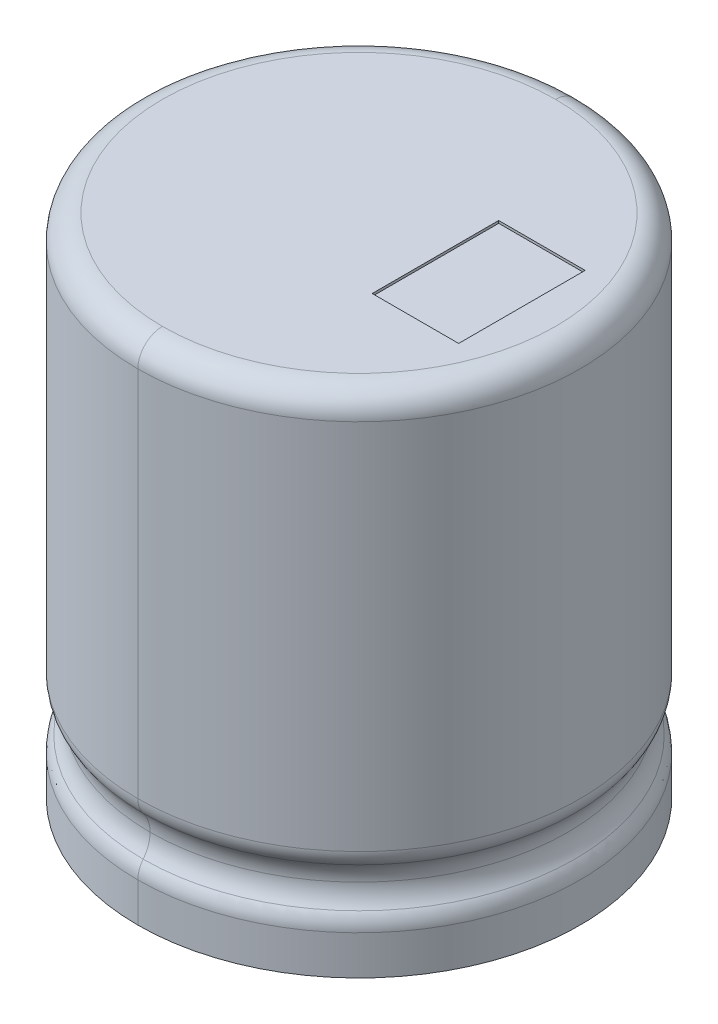
ISO-10303-21;
HEADER;
FILE_DESCRIPTION(('STEP AP214'),'2;1');
FILE_NAME('part.step','',(''),(''),'','','');
FILE_SCHEMA(('AUTOMOTIVE_DESIGN { 1 0 10303 214 1 1 1 1 }'));
ENDSEC;
DATA;
#1=APPLICATION_CONTEXT('core data for automotive mechanical design processes');
#2=APPLICATION_PROTOCOL_DEFINITION('international standard','automotive_design',2000,#1);
#3=PRODUCT_CONTEXT('',#1,'mechanical');
#4=PRODUCT('Part','Part','',(#3));
#5=PRODUCT_RELATED_PRODUCT_CATEGORY('part','',(#4));
#6=PRODUCT_DEFINITION_FORMATION('','',#4);
#7=PRODUCT_DEFINITION_CONTEXT('part definition',#1,'design');
#8=PRODUCT_DEFINITION('design','',#6,#7);
#9=PRODUCT_DEFINITION_SHAPE('','',#8);
#10=(LENGTH_UNIT() NAMED_UNIT(*) SI_UNIT(.MILLI.,.METRE.));
#11=(NAMED_UNIT(*) PLANE_ANGLE_UNIT() SI_UNIT($,.RADIAN.));
#12=(NAMED_UNIT(*) SI_UNIT($,.STERADIAN.) SOLID_ANGLE_UNIT());
#13=UNCERTAINTY_MEASURE_WITH_UNIT(LENGTH_MEASURE(1.E-05),#10,'distance_accuracy_value','');
#14=(GEOMETRIC_REPRESENTATION_CONTEXT(3) GLOBAL_UNCERTAINTY_ASSIGNED_CONTEXT((#13)) GLOBAL_UNIT_ASSIGNED_CONTEXT((#10,
#11,#12)) REPRESENTATION_CONTEXT('',''));
#15=CARTESIAN_POINT('',(0.,0.,0.));
#16=DIRECTION('',(0.,0.,1.));
#17=DIRECTION('',(1.,0.,0.));
#18=AXIS2_PLACEMENT_3D('',#15,#16,#17);
#19=CARTESIAN_POINT('',(0.,4.424695076596,0.));
#20=DIRECTION('',(0.,-1.,0.));
#21=DIRECTION('',(0.,0.,-1.));
#22=AXIS2_PLACEMENT_3D('',#19,#20,#21);
#23=TOROIDAL_SURFACE('',#22,9.8,1.3);
#24=CARTESIAN_POINT('',(0.,4.424695076596,-9.8));
#25=DIRECTION('',(-1.,0.,0.));
#26=DIRECTION('',(0.,0.,1.));
#27=AXIS2_PLACEMENT_3D('',#24,#25,#26);
#28=CIRCLE('',#27,1.3);
#29=CARTESIAN_POINT('',(0.,3.615426929541,-8.782608695652));
#30=VERTEX_POINT('',#29);
#31=CARTESIAN_POINT('',(0.,4.424695076596,-8.5));
#32=VERTEX_POINT('',#31);
#33=EDGE_CURVE('E11',#30,#32,#28,.T.);
#34=ORIENTED_EDGE('',*,*,#33,.T.);
#35=CARTESIAN_POINT('',(0.,4.424695076596,0.));
#36=DIRECTION('',(0.,-1.,0.));
#37=DIRECTION('',(0.,0.,-1.));
#38=AXIS2_PLACEMENT_3D('',#35,#36,#37);
#39=CIRCLE('',#38,8.5);
#40=CARTESIAN_POINT('',(0.,4.424695076596,8.5));
#41=VERTEX_POINT('',#40);
#42=EDGE_CURVE('E24',#32,#41,#39,.T.);
#43=ORIENTED_EDGE('',*,*,#42,.T.);
#44=CARTESIAN_POINT('',(0.,4.424695076596,9.8));
#45=DIRECTION('',(1.,0.,0.));
#46=DIRECTION('',(0.,0.,-1.));
#47=AXIS2_PLACEMENT_3D('',#44,#45,#46);
#48=CIRCLE('',#47,1.3);
#49=CARTESIAN_POINT('',(0.,3.615426929541,8.782608695652));
#50=VERTEX_POINT('',#49);
#51=EDGE_CURVE('E220',#50,#41,#48,.T.);
#52=ORIENTED_EDGE('',*,*,#51,.F.);
#53=CARTESIAN_POINT('',(0.,3.615426929541,0.));
#54=DIRECTION('',(0.,1.,0.));
#55=DIRECTION('',(0.,0.,1.));
#56=AXIS2_PLACEMENT_3D('',#53,#54,#55);
#57=CIRCLE('',#56,8.782608695652);
#58=EDGE_CURVE('E36',#50,#30,#57,.T.);
#59=ORIENTED_EDGE('',*,*,#58,.T.);
#60=EDGE_LOOP('',(#34,#43,#52,#59));
#61=FACE_BOUND('',#60,.T.);
#62=ADVANCED_FACE('F17',(#61),#23,.F.);
#63=CARTESIAN_POINT('',(0.,4.424695076596,0.));
#64=DIRECTION('',(0.,-1.,0.));
#65=DIRECTION('',(0.,0.,-1.));
#66=AXIS2_PLACEMENT_3D('',#63,#64,#65);
#67=TOROIDAL_SURFACE('',#66,9.8,1.3);
#68=ORIENTED_EDGE('',*,*,#51,.T.);
#69=CARTESIAN_POINT('',(0.,4.424695076596,0.));
#70=DIRECTION('',(0.,-1.,0.));
#71=DIRECTION('',(0.,0.,-1.));
#72=AXIS2_PLACEMENT_3D('',#69,#70,#71);
#73=CIRCLE('',#72,8.5);
#74=EDGE_CURVE('E216',#41,#32,#73,.T.);
#75=ORIENTED_EDGE('',*,*,#74,.T.);
#76=ORIENTED_EDGE('',*,*,#33,.F.);
#77=CARTESIAN_POINT('',(0.,3.615426929541,0.));
#78=DIRECTION('',(0.,1.,0.));
#79=DIRECTION('',(0.,0.,1.));
#80=AXIS2_PLACEMENT_3D('',#77,#78,#79);
#81=CIRCLE('',#80,8.782608695652);
#82=EDGE_CURVE('E213',#30,#50,#81,.T.);
#83=ORIENTED_EDGE('',*,*,#82,.T.);
#84=EDGE_LOOP('',(#68,#75,#76,#83));
#85=FACE_BOUND('',#84,.T.);
#86=ADVANCED_FACE('F262',(#85),#67,.F.);
#87=CARTESIAN_POINT('',(0.,5.856477182924,0.));
#88=DIRECTION('',(0.,1.,0.));
#89=DIRECTION('',(0.,0.,1.));
#90=AXIS2_PLACEMENT_3D('',#87,#88,#89);
#91=TOROIDAL_SURFACE('',#90,8.,1.);
#92=CARTESIAN_POINT('',(0.,5.233963223651,0.));
#93=DIRECTION('',(0.,-1.,0.));
#94=DIRECTION('',(0.,0.,-1.));
#95=AXIS2_PLACEMENT_3D('',#92,#93,#94);
#96=CIRCLE('',#95,8.782608695652);
#97=CARTESIAN_POINT('',(0.,5.233963223651,-8.782608695652));
#98=VERTEX_POINT('',#97);
#99=CARTESIAN_POINT('',(0.,5.233963223651,8.782608695652));
#100=VERTEX_POINT('',#99);
#101=EDGE_CURVE('E211',#98,#100,#96,.T.);
#102=ORIENTED_EDGE('',*,*,#101,.F.);
#103=CARTESIAN_POINT('',(0.,5.856477182924,-8.));
#104=DIRECTION('',(1.,0.,0.));
#105=DIRECTION('',(0.,0.,-1.));
#106=AXIS2_PLACEMENT_3D('',#103,#104,#105);
#107=CIRCLE('',#106,1.);
#108=CARTESIAN_POINT('',(0.,5.856477182924,-9.));
#109=VERTEX_POINT('',#108);
#110=EDGE_CURVE('E209',#98,#109,#107,.T.);
#111=ORIENTED_EDGE('',*,*,#110,.T.);
#112=CARTESIAN_POINT('',(0.,5.856477182924,0.));
#113=DIRECTION('',(0.,1.,0.));
#114=DIRECTION('',(0.,0.,1.));
#115=AXIS2_PLACEMENT_3D('',#112,#113,#114);
#116=CIRCLE('',#115,9.);
#117=CARTESIAN_POINT('',(0.,5.856477182924,9.));
#118=VERTEX_POINT('',#117);
#119=EDGE_CURVE('E206',#118,#109,#116,.T.);
#120=ORIENTED_EDGE('',*,*,#119,.F.);
#121=CARTESIAN_POINT('',(0.,5.856477182924,8.));
#122=DIRECTION('',(-1.,0.,0.));
#123=DIRECTION('',(0.,0.,1.));
#124=AXIS2_PLACEMENT_3D('',#121,#122,#123);
#125=CIRCLE('',#124,1.);
#126=EDGE_CURVE('E203',#100,#118,#125,.T.);
#127=ORIENTED_EDGE('',*,*,#126,.F.);
#128=EDGE_LOOP('',(#102,#111,#120,#127));
#129=FACE_BOUND('',#128,.T.);
#130=ADVANCED_FACE('F231',(#129),#91,.T.);
#131=CARTESIAN_POINT('',(0.,2.992912970268,0.));
#132=DIRECTION('',(0.,1.,0.));
#133=DIRECTION('',(0.,0.,1.));
#134=AXIS2_PLACEMENT_3D('',#131,#132,#133);
#135=TOROIDAL_SURFACE('',#134,8.,1.);
#136=CARTESIAN_POINT('',(0.,2.992912970268,0.));
#137=DIRECTION('',(0.,-1.,0.));
#138=DIRECTION('',(0.,0.,1.));
#139=AXIS2_PLACEMENT_3D('',#136,#137,#138);
#140=CIRCLE('',#139,9.);
#141=CARTESIAN_POINT('',(0.,2.992912970268,-9.));
#142=VERTEX_POINT('',#141);
#143=CARTESIAN_POINT('',(0.,2.992912970268,9.));
#144=VERTEX_POINT('',#143);
#145=EDGE_CURVE('E201',#142,#144,#140,.T.);
#146=ORIENTED_EDGE('',*,*,#145,.F.);
#147=CARTESIAN_POINT('',(0.,2.992912970268,-8.));
#148=DIRECTION('',(1.,0.,0.));
#149=DIRECTION('',(0.,0.,-1.));
#150=AXIS2_PLACEMENT_3D('',#147,#148,#149);
#151=CIRCLE('',#150,1.);
#152=EDGE_CURVE('E198',#142,#30,#151,.T.);
#153=ORIENTED_EDGE('',*,*,#152,.T.);
#154=ORIENTED_EDGE('',*,*,#58,.F.);
#155=CARTESIAN_POINT('',(0.,2.992912970268,8.));
#156=DIRECTION('',(-1.,0.,0.));
#157=DIRECTION('',(0.,0.,1.));
#158=AXIS2_PLACEMENT_3D('',#155,#156,#157);
#159=CIRCLE('',#158,1.);
#160=EDGE_CURVE('E195',#144,#50,#159,.T.);
#161=ORIENTED_EDGE('',*,*,#160,.F.);
#162=EDGE_LOOP('',(#146,#153,#154,#161));
#163=FACE_BOUND('',#162,.T.);
#164=ADVANCED_FACE('F269',(#163),#135,.T.);
#165=CARTESIAN_POINT('',(0.,-3.411314573766,0.));
#166=DIRECTION('',(0.,-1.,0.));
#167=DIRECTION('',(0.,0.,-1.));
#168=AXIS2_PLACEMENT_3D('',#165,#166,#167);
#169=CYLINDRICAL_SURFACE('',#168,9.);
#170=ORIENTED_EDGE('',*,*,#145,.T.);
#171=DIRECTION('',(0.,-1.,0.));
#172=VECTOR('',#171,1.);
#173=CARTESIAN_POINT('',(0.,-3.411314573766,9.));
#174=LINE('',#173,#172);
#175=CARTESIAN_POINT('',(0.,1.4,9.));
#176=VERTEX_POINT('',#175);
#177=EDGE_CURVE('E193',#144,#176,#174,.T.);
#178=ORIENTED_EDGE('',*,*,#177,.T.);
#179=CARTESIAN_POINT('',(0.,1.4,0.));
#180=DIRECTION('',(0.,-1.,0.));
#181=DIRECTION('',(0.,0.,-1.));
#182=AXIS2_PLACEMENT_3D('',#179,#180,#181);
#183=CIRCLE('',#182,9.);
#184=CARTESIAN_POINT('',(0.,1.4,-9.));
#185=VERTEX_POINT('',#184);
#186=EDGE_CURVE('E190',#185,#176,#183,.T.);
#187=ORIENTED_EDGE('',*,*,#186,.F.);
#188=DIRECTION('',(0.,-1.,0.));
#189=VECTOR('',#188,1.);
#190=CARTESIAN_POINT('',(0.,-3.411314573766,-9.));
#191=LINE('',#190,#189);
#192=EDGE_CURVE('E187',#142,#185,#191,.T.);
#193=ORIENTED_EDGE('',*,*,#192,.F.);
#194=EDGE_LOOP('',(#170,#178,#187,#193));
#195=FACE_BOUND('',#194,.T.);
#196=ADVANCED_FACE('F274',(#195),#169,.T.);
#197=CARTESIAN_POINT('',(0.,4.424695076596,0.));
#198=DIRECTION('',(0.,-1.,0.));
#199=DIRECTION('',(0.,0.,-1.));
#200=AXIS2_PLACEMENT_3D('',#197,#198,#199);
#201=TOROIDAL_SURFACE('',#200,9.8,1.3);
#202=ORIENTED_EDGE('',*,*,#74,.F.);
#203=CARTESIAN_POINT('',(0.,4.424695076596,9.8));
#204=DIRECTION('',(1.,0.,0.));
#205=DIRECTION('',(0.,0.,-1.));
#206=AXIS2_PLACEMENT_3D('',#203,#204,#205);
#207=CIRCLE('',#206,1.3);
#208=EDGE_CURVE('E184',#41,#100,#207,.T.);
#209=ORIENTED_EDGE('',*,*,#208,.T.);
#210=CARTESIAN_POINT('',(0.,5.233963223651,0.));
#211=DIRECTION('',(0.,-1.,0.));
#212=DIRECTION('',(0.,0.,-1.));
#213=AXIS2_PLACEMENT_3D('',#210,#211,#212);
#214=CIRCLE('',#213,8.782608695652);
#215=EDGE_CURVE('E181',#100,#98,#214,.T.);
#216=ORIENTED_EDGE('',*,*,#215,.T.);
#217=CARTESIAN_POINT('',(0.,4.424695076596,-9.8));
#218=DIRECTION('',(-1.,0.,0.));
#219=DIRECTION('',(0.,0.,1.));
#220=AXIS2_PLACEMENT_3D('',#217,#218,#219);
#221=CIRCLE('',#220,1.3);
#222=EDGE_CURVE('E179',#32,#98,#221,.T.);
#223=ORIENTED_EDGE('',*,*,#222,.F.);
#224=EDGE_LOOP('',(#202,#209,#216,#223));
#225=FACE_BOUND('',#224,.T.);
#226=ADVANCED_FACE('F224',(#225),#201,.F.);
#227=CARTESIAN_POINT('',(0.,-3.411314573766,0.));
#228=DIRECTION('',(0.,-1.,0.));
#229=DIRECTION('',(0.,0.,-1.));
#230=AXIS2_PLACEMENT_3D('',#227,#228,#229);
#231=CYLINDRICAL_SURFACE('',#230,9.);
#232=CARTESIAN_POINT('',(0.,21.,0.));
#233=DIRECTION('',(0.,-1.,0.));
#234=DIRECTION('',(0.,0.,-1.));
#235=AXIS2_PLACEMENT_3D('',#232,#233,#234);
#236=CIRCLE('',#235,9.);
#237=CARTESIAN_POINT('',(0.,21.,-9.));
#238=VERTEX_POINT('',#237);
#239=CARTESIAN_POINT('',(0.,21.,9.));
#240=VERTEX_POINT('',#239);
#241=EDGE_CURVE('E177',#238,#240,#236,.T.);
#242=ORIENTED_EDGE('',*,*,#241,.T.);
#243=DIRECTION('',(0.,-1.,0.));
#244=VECTOR('',#243,1.);
#245=CARTESIAN_POINT('',(0.,-3.411314573766,9.));
#246=LINE('',#245,#244);
#247=EDGE_CURVE('E174',#240,#118,#246,.T.);
#248=ORIENTED_EDGE('',*,*,#247,.T.);
#249=ORIENTED_EDGE('',*,*,#119,.T.);
#250=DIRECTION('',(0.,-1.,0.));
#251=VECTOR('',#250,1.);
#252=CARTESIAN_POINT('',(0.,-3.411314573766,-9.));
#253=LINE('',#252,#251);
#254=EDGE_CURVE('E171',#238,#109,#253,.T.);
#255=ORIENTED_EDGE('',*,*,#254,.F.);
#256=EDGE_LOOP('',(#242,#248,#249,#255));
#257=FACE_BOUND('',#256,.T.);
#258=ADVANCED_FACE('F237',(#257),#231,.T.);
#259=CARTESIAN_POINT('',(0.,21.,0.));
#260=DIRECTION('',(0.,-1.,0.));
#261=DIRECTION('',(0.,0.,-1.));
#262=AXIS2_PLACEMENT_3D('',#259,#260,#261);
#263=TOROIDAL_SURFACE('',#262,8.,1.);
#264=CARTESIAN_POINT('',(0.,22.,0.));
#265=DIRECTION('',(0.,-1.,0.));
#266=DIRECTION('',(0.,0.,-1.));
#267=AXIS2_PLACEMENT_3D('',#264,#265,#266);
#268=CIRCLE('',#267,8.);
#269=CARTESIAN_POINT('',(0.,22.,-8.));
#270=VERTEX_POINT('',#269);
#271=CARTESIAN_POINT('',(0.,22.,8.));
#272=VERTEX_POINT('',#271);
#273=EDGE_CURVE('E169',#270,#272,#268,.T.);
#274=ORIENTED_EDGE('',*,*,#273,.T.);
#275=CARTESIAN_POINT('',(0.,21.,8.));
#276=DIRECTION('',(1.,0.,0.));
#277=DIRECTION('',(0.,0.,-1.));
#278=AXIS2_PLACEMENT_3D('',#275,#276,#277);
#279=CIRCLE('',#278,1.);
#280=EDGE_CURVE('E166',#272,#240,#279,.T.);
#281=ORIENTED_EDGE('',*,*,#280,.T.);
#282=ORIENTED_EDGE('',*,*,#241,.F.);
#283=CARTESIAN_POINT('',(0.,21.,-8.));
#284=DIRECTION('',(-1.,0.,0.));
#285=DIRECTION('',(0.,0.,1.));
#286=AXIS2_PLACEMENT_3D('',#283,#284,#285);
#287=CIRCLE('',#286,1.);
#288=EDGE_CURVE('E163',#270,#238,#287,.T.);
#289=ORIENTED_EDGE('',*,*,#288,.F.);
#290=EDGE_LOOP('',(#274,#281,#282,#289));
#291=FACE_BOUND('',#290,.T.);
#292=ADVANCED_FACE('F248',(#291),#263,.T.);
#293=CARTESIAN_POINT('',(-8.,22.,0.));
#294=DIRECTION('',(0.,-1.,0.));
#295=DIRECTION('',(0.,0.,-1.));
#296=AXIS2_PLACEMENT_3D('',#293,#294,#295);
#297=PLANE('',#296);
#298=DIRECTION('',(-1.,0.,0.));
#299=VECTOR('',#298,1.);
#300=CARTESIAN_POINT('',(3.110415140968,22.,-2.573615632082));
#301=LINE('',#300,#299);
#302=CARTESIAN_POINT('',(6.628363968557,22.,-2.573615632082));
#303=VERTEX_POINT('',#302);
#304=CARTESIAN_POINT('',(3.110415140968,22.,-2.573615632082));
#305=VERTEX_POINT('',#304);
#306=EDGE_CURVE('E122',#303,#305,#301,.T.);
#307=ORIENTED_EDGE('',*,*,#306,.F.);
#308=DIRECTION('',(0.,0.,-1.));
#309=VECTOR('',#308,1.);
#310=CARTESIAN_POINT('',(6.628363968557,22.,2.573615632082));
#311=LINE('',#310,#309);
#312=CARTESIAN_POINT('',(6.628363968557,22.,2.573615632082));
#313=VERTEX_POINT('',#312);
#314=EDGE_CURVE('E159',#313,#303,#311,.T.);
#315=ORIENTED_EDGE('',*,*,#314,.F.);
#316=DIRECTION('',(1.,0.,0.));
#317=VECTOR('',#316,1.);
#318=CARTESIAN_POINT('',(3.110415140968,22.,2.573615632082));
#319=LINE('',#318,#317);
#320=CARTESIAN_POINT('',(3.110415140968,22.,2.573615632082));
#321=VERTEX_POINT('',#320);
#322=EDGE_CURVE('E156',#321,#313,#319,.T.);
#323=ORIENTED_EDGE('',*,*,#322,.F.);
#324=DIRECTION('',(0.,0.,1.));
#325=VECTOR('',#324,1.);
#326=CARTESIAN_POINT('',(3.110415140968,22.,2.573615632082));
#327=LINE('',#326,#325);
#328=EDGE_CURVE('E154',#305,#321,#327,.T.);
#329=ORIENTED_EDGE('',*,*,#328,.F.);
#330=EDGE_LOOP('',(#307,#315,#323,#329));
#331=FACE_BOUND('',#330,.T.);
#332=ORIENTED_EDGE('',*,*,#273,.F.);
#333=CARTESIAN_POINT('',(0.,22.,0.));
#334=DIRECTION('',(0.,-1.,0.));
#335=DIRECTION('',(0.,0.,-1.));
#336=AXIS2_PLACEMENT_3D('',#333,#334,#335);
#337=CIRCLE('',#336,8.);
#338=EDGE_CURVE('E151',#272,#270,#337,.T.);
#339=ORIENTED_EDGE('',*,*,#338,.F.);
#340=EDGE_LOOP('',(#332,#339));
#341=FACE_BOUND('',#340,.T.);
#342=ADVANCED_FACE('F250',(#331,#341),#297,.F.);
#343=CARTESIAN_POINT('',(0.,21.,0.));
#344=DIRECTION('',(0.,-1.,0.));
#345=DIRECTION('',(0.,0.,-1.));
#346=AXIS2_PLACEMENT_3D('',#343,#344,#345);
#347=TOROIDAL_SURFACE('',#346,8.,1.);
#348=ORIENTED_EDGE('',*,*,#280,.F.);
#349=ORIENTED_EDGE('',*,*,#338,.T.);
#350=ORIENTED_EDGE('',*,*,#288,.T.);
#351=CARTESIAN_POINT('',(0.,21.,0.));
#352=DIRECTION('',(0.,-1.,0.));
#353=DIRECTION('',(0.,0.,-1.));
#354=AXIS2_PLACEMENT_3D('',#351,#352,#353);
#355=CIRCLE('',#354,9.);
#356=EDGE_CURVE('E148',#240,#238,#355,.T.);
#357=ORIENTED_EDGE('',*,*,#356,.F.);
#358=EDGE_LOOP('',(#348,#349,#350,#357));
#359=FACE_BOUND('',#358,.T.);
#360=ADVANCED_FACE('F244',(#359),#347,.T.);
#361=CARTESIAN_POINT('',(0.,-3.411314573766,0.));
#362=DIRECTION('',(0.,-1.,0.));
#363=DIRECTION('',(0.,0.,-1.));
#364=AXIS2_PLACEMENT_3D('',#361,#362,#363);
#365=CYLINDRICAL_SURFACE('',#364,9.);
#366=ORIENTED_EDGE('',*,*,#247,.F.);
#367=ORIENTED_EDGE('',*,*,#356,.T.);
#368=ORIENTED_EDGE('',*,*,#254,.T.);
#369=CARTESIAN_POINT('',(0.,5.856477182924,0.));
#370=DIRECTION('',(0.,1.,0.));
#371=DIRECTION('',(0.,0.,1.));
#372=AXIS2_PLACEMENT_3D('',#369,#370,#371);
#373=CIRCLE('',#372,9.);
#374=EDGE_CURVE('E145',#109,#118,#373,.T.);
#375=ORIENTED_EDGE('',*,*,#374,.T.);
#376=EDGE_LOOP('',(#366,#367,#368,#375));
#377=FACE_BOUND('',#376,.T.);
#378=ADVANCED_FACE('F240',(#377),#365,.T.);
#379=CARTESIAN_POINT('',(0.,4.424695076596,0.));
#380=DIRECTION('',(0.,-1.,0.));
#381=DIRECTION('',(0.,0.,-1.));
#382=AXIS2_PLACEMENT_3D('',#379,#380,#381);
#383=TOROIDAL_SURFACE('',#382,9.8,1.3);
#384=ORIENTED_EDGE('',*,*,#42,.F.);
#385=ORIENTED_EDGE('',*,*,#222,.T.);
#386=ORIENTED_EDGE('',*,*,#101,.T.);
#387=ORIENTED_EDGE('',*,*,#208,.F.);
#388=EDGE_LOOP('',(#384,#385,#386,#387));
#389=FACE_BOUND('',#388,.T.);
#390=ADVANCED_FACE('F226',(#389),#383,.F.);
#391=CARTESIAN_POINT('',(0.,-3.411314573766,0.));
#392=DIRECTION('',(0.,-1.,0.));
#393=DIRECTION('',(0.,0.,-1.));
#394=AXIS2_PLACEMENT_3D('',#391,#392,#393);
#395=CYLINDRICAL_SURFACE('',#394,9.);
#396=ORIENTED_EDGE('',*,*,#177,.F.);
#397=CARTESIAN_POINT('',(0.,2.992912970268,0.));
#398=DIRECTION('',(0.,-1.,0.));
#399=DIRECTION('',(0.,0.,1.));
#400=AXIS2_PLACEMENT_3D('',#397,#398,#399);
#401=CIRCLE('',#400,9.);
#402=EDGE_CURVE('E142',#144,#142,#401,.T.);
#403=ORIENTED_EDGE('',*,*,#402,.T.);
#404=ORIENTED_EDGE('',*,*,#192,.T.);
#405=CARTESIAN_POINT('',(0.,1.4,0.));
#406=DIRECTION('',(0.,-1.,0.));
#407=DIRECTION('',(0.,0.,-1.));
#408=AXIS2_PLACEMENT_3D('',#405,#406,#407);
#409=CIRCLE('',#408,9.);
#410=EDGE_CURVE('E139',#176,#185,#409,.T.);
#411=ORIENTED_EDGE('',*,*,#410,.F.);
#412=EDGE_LOOP('',(#396,#403,#404,#411));
#413=FACE_BOUND('',#412,.T.);
#414=ADVANCED_FACE('F325',(#413),#395,.T.);
#415=CARTESIAN_POINT('',(0.,1.4,0.));
#416=DIRECTION('',(0.,1.,0.));
#417=DIRECTION('',(0.,0.,1.));
#418=AXIS2_PLACEMENT_3D('',#415,#416,#417);
#419=PLANE('',#418);
#420=ORIENTED_EDGE('',*,*,#186,.T.);
#421=ORIENTED_EDGE('',*,*,#410,.T.);
#422=EDGE_LOOP('',(#420,#421));
#423=FACE_BOUND('',#422,.T.);
#424=ADVANCED_FACE('F334',(#423),#419,.F.);
#425=CARTESIAN_POINT('',(0.,2.992912970268,0.));
#426=DIRECTION('',(0.,1.,0.));
#427=DIRECTION('',(0.,0.,1.));
#428=AXIS2_PLACEMENT_3D('',#425,#426,#427);
#429=TOROIDAL_SURFACE('',#428,8.,1.);
#430=ORIENTED_EDGE('',*,*,#152,.F.);
#431=ORIENTED_EDGE('',*,*,#402,.F.);
#432=ORIENTED_EDGE('',*,*,#160,.T.);
#433=ORIENTED_EDGE('',*,*,#82,.F.);
#434=EDGE_LOOP('',(#430,#431,#432,#433));
#435=FACE_BOUND('',#434,.T.);
#436=ADVANCED_FACE('F344',(#435),#429,.T.);
#437=CARTESIAN_POINT('',(0.,5.856477182924,0.));
#438=DIRECTION('',(0.,1.,0.));
#439=DIRECTION('',(0.,0.,1.));
#440=AXIS2_PLACEMENT_3D('',#437,#438,#439);
#441=TOROIDAL_SURFACE('',#440,8.,1.);
#442=ORIENTED_EDGE('',*,*,#110,.F.);
#443=ORIENTED_EDGE('',*,*,#215,.F.);
#444=ORIENTED_EDGE('',*,*,#126,.T.);
#445=ORIENTED_EDGE('',*,*,#374,.F.);
#446=EDGE_LOOP('',(#442,#443,#444,#445));
#447=FACE_BOUND('',#446,.T.);
#448=ADVANCED_FACE('F234',(#447),#441,.T.);
#449=CARTESIAN_POINT('',(6.628363968557,21.9,2.573615632082));
#450=DIRECTION('',(1.,0.,0.));
#451=DIRECTION('',(0.,0.,-1.));
#452=AXIS2_PLACEMENT_3D('',#449,#450,#451);
#453=PLANE('',#452);
#454=ORIENTED_EDGE('',*,*,#314,.T.);
#455=DIRECTION('',(0.,1.,0.));
#456=VECTOR('',#455,1.);
#457=CARTESIAN_POINT('',(6.628363968557,21.9,-2.573615632082));
#458=LINE('',#457,#456);
#459=CARTESIAN_POINT('',(6.628363968557,21.9,-2.573615632082));
#460=VERTEX_POINT('',#459);
#461=EDGE_CURVE('E137',#460,#303,#458,.T.);
#462=ORIENTED_EDGE('',*,*,#461,.F.);
#463=DIRECTION('',(0.,0.,-1.));
#464=VECTOR('',#463,1.);
#465=CARTESIAN_POINT('',(6.628363968557,21.9,2.573615632082));
#466=LINE('',#465,#464);
#467=CARTESIAN_POINT('',(6.628363968557,21.9,2.573615632082));
#468=VERTEX_POINT('',#467);
#469=EDGE_CURVE('E127',#468,#460,#466,.T.);
#470=ORIENTED_EDGE('',*,*,#469,.F.);
#471=DIRECTION('',(0.,1.,0.));
#472=VECTOR('',#471,1.);
#473=CARTESIAN_POINT('',(6.628363968557,21.9,2.573615632082));
#474=LINE('',#473,#472);
#475=EDGE_CURVE('E133',#468,#313,#474,.T.);
#476=ORIENTED_EDGE('',*,*,#475,.T.);
#477=EDGE_LOOP('',(#454,#462,#470,#476));
#478=FACE_BOUND('',#477,.T.);
#479=ADVANCED_FACE('F363',(#478),#453,.F.);
#480=CARTESIAN_POINT('',(3.110415140968,21.9,2.573615632082));
#481=DIRECTION('',(0.,0.,1.));
#482=DIRECTION('',(1.,0.,0.));
#483=AXIS2_PLACEMENT_3D('',#480,#481,#482);
#484=PLANE('',#483);
#485=ORIENTED_EDGE('',*,*,#322,.T.);
#486=ORIENTED_EDGE('',*,*,#475,.F.);
#487=DIRECTION('',(1.,0.,0.));
#488=VECTOR('',#487,1.);
#489=CARTESIAN_POINT('',(3.110415140968,21.9,2.573615632082));
#490=LINE('',#489,#488);
#491=CARTESIAN_POINT('',(3.110415140968,21.9,2.573615632082));
#492=VERTEX_POINT('',#491);
#493=EDGE_CURVE('E131',#492,#468,#490,.T.);
#494=ORIENTED_EDGE('',*,*,#493,.F.);
#495=DIRECTION('',(0.,1.,0.));
#496=VECTOR('',#495,1.);
#497=CARTESIAN_POINT('',(3.110415140968,21.9,2.573615632082));
#498=LINE('',#497,#496);
#499=EDGE_CURVE('E112',#492,#321,#498,.T.);
#500=ORIENTED_EDGE('',*,*,#499,.T.);
#501=EDGE_LOOP('',(#485,#486,#494,#500));
#502=FACE_BOUND('',#501,.T.);
#503=ADVANCED_FACE('F372',(#502),#484,.F.);
#504=CARTESIAN_POINT('',(3.110415140968,21.9,2.573615632082));
#505=DIRECTION('',(-1.,0.,0.));
#506=DIRECTION('',(0.,0.,1.));
#507=AXIS2_PLACEMENT_3D('',#504,#505,#506);
#508=PLANE('',#507);
#509=ORIENTED_EDGE('',*,*,#328,.T.);
#510=ORIENTED_EDGE('',*,*,#499,.F.);
#511=DIRECTION('',(0.,0.,1.));
#512=VECTOR('',#511,1.);
#513=CARTESIAN_POINT('',(3.110415140968,21.9,2.573615632082));
#514=LINE('',#513,#512);
#515=CARTESIAN_POINT('',(3.110415140968,21.9,-2.573615632082));
#516=VERTEX_POINT('',#515);
#517=EDGE_CURVE('E106',#516,#492,#514,.T.);
#518=ORIENTED_EDGE('',*,*,#517,.F.);
#519=DIRECTION('',(0.,1.,0.));
#520=VECTOR('',#519,1.);
#521=CARTESIAN_POINT('',(3.110415140968,21.9,-2.573615632082));
#522=LINE('',#521,#520);
#523=EDGE_CURVE('E110',#516,#305,#522,.T.);
#524=ORIENTED_EDGE('',*,*,#523,.T.);
#525=EDGE_LOOP('',(#509,#510,#518,#524));
#526=FACE_BOUND('',#525,.T.);
#527=ADVANCED_FACE('F109',(#526),#508,.F.);
#528=CARTESIAN_POINT('',(3.110415140968,21.9,-2.573615632082));
#529=DIRECTION('',(0.,0.,-1.));
#530=DIRECTION('',(-1.,0.,0.));
#531=AXIS2_PLACEMENT_3D('',#528,#529,#530);
#532=PLANE('',#531);
#533=ORIENTED_EDGE('',*,*,#306,.T.);
#534=ORIENTED_EDGE('',*,*,#523,.F.);
#535=DIRECTION('',(-1.,0.,0.));
#536=VECTOR('',#535,1.);
#537=CARTESIAN_POINT('',(3.110415140968,21.9,-2.573615632082));
#538=LINE('',#537,#536);
#539=EDGE_CURVE('E121',#460,#516,#538,.T.);
#540=ORIENTED_EDGE('',*,*,#539,.F.);
#541=ORIENTED_EDGE('',*,*,#461,.T.);
#542=EDGE_LOOP('',(#533,#534,#540,#541));
#543=FACE_BOUND('',#542,.T.);
#544=ADVANCED_FACE('F119',(#543),#532,.F.);
#545=CARTESIAN_POINT('',(0.,21.9,0.));
#546=DIRECTION('',(0.,-1.,0.));
#547=DIRECTION('',(0.,0.,-1.));
#548=AXIS2_PLACEMENT_3D('',#545,#546,#547);
#549=PLANE('',#548);
#550=ORIENTED_EDGE('',*,*,#469,.T.);
#551=ORIENTED_EDGE('',*,*,#539,.T.);
#552=ORIENTED_EDGE('',*,*,#517,.T.);
#553=ORIENTED_EDGE('',*,*,#493,.T.);
#554=EDGE_LOOP('',(#550,#551,#552,#553));
#555=FACE_BOUND('',#554,.T.);
#556=ADVANCED_FACE('F126',(#555),#549,.F.);
#557=CLOSED_SHELL('',(#62,#86,#130,#164,#196,#226,#258,#292,#342,#360,#378,#390,#414,#424,#436,
#448,#479,#503,#527,#544,#556));
#558=MANIFOLD_SOLID_BREP('B1',#557);
#559=ADVANCED_BREP_SHAPE_REPRESENTATION('',(#18,#558),#14);
#560=SHAPE_DEFINITION_REPRESENTATION(#9,#559);
ENDSEC;
END-ISO-10303-21;
